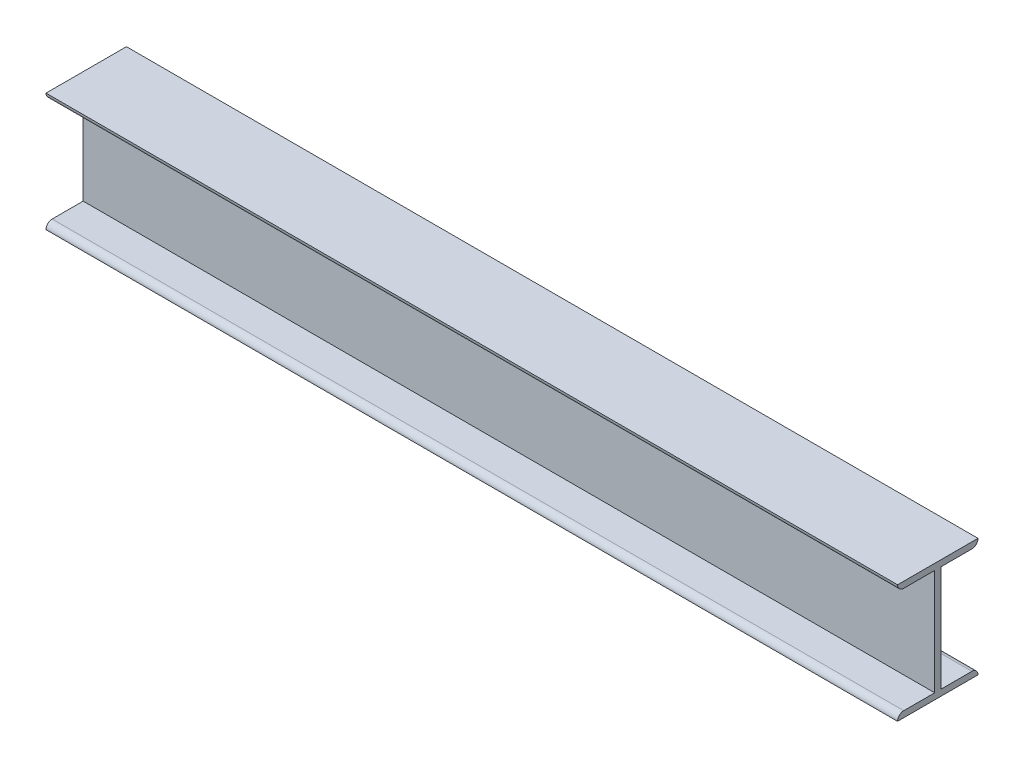
ISO-10303-21;
HEADER;
FILE_DESCRIPTION(('STEP AP214'),'2;1');
FILE_NAME('part.step','',(''),(''),'','','');
FILE_SCHEMA(('AUTOMOTIVE_DESIGN { 1 0 10303 214 1 1 1 1 }'));
ENDSEC;
DATA;
#1=APPLICATION_CONTEXT('core data for automotive mechanical design processes');
#2=APPLICATION_PROTOCOL_DEFINITION('international standard','automotive_design',2000,#1);
#3=PRODUCT_CONTEXT('',#1,'mechanical');
#4=PRODUCT('Part','Part','',(#3));
#5=PRODUCT_RELATED_PRODUCT_CATEGORY('part','',(#4));
#6=PRODUCT_DEFINITION_FORMATION('','',#4);
#7=PRODUCT_DEFINITION_CONTEXT('part definition',#1,'design');
#8=PRODUCT_DEFINITION('design','',#6,#7);
#9=PRODUCT_DEFINITION_SHAPE('','',#8);
#10=(LENGTH_UNIT() NAMED_UNIT(*) SI_UNIT(.MILLI.,.METRE.));
#11=(NAMED_UNIT(*) PLANE_ANGLE_UNIT() SI_UNIT($,.RADIAN.));
#12=(NAMED_UNIT(*) SI_UNIT($,.STERADIAN.) SOLID_ANGLE_UNIT());
#13=UNCERTAINTY_MEASURE_WITH_UNIT(LENGTH_MEASURE(1.E-05),#10,'distance_accuracy_value','');
#14=(GEOMETRIC_REPRESENTATION_CONTEXT(3) GLOBAL_UNCERTAINTY_ASSIGNED_CONTEXT((#13)) GLOBAL_UNIT_ASSIGNED_CONTEXT((#10,
#11,#12)) REPRESENTATION_CONTEXT('',''));
#15=CARTESIAN_POINT('',(0.,0.,0.));
#16=DIRECTION('',(0.,0.,1.));
#17=DIRECTION('',(1.,0.,0.));
#18=AXIS2_PLACEMENT_3D('',#15,#16,#17);
#19=CARTESIAN_POINT('',(0.,250.,170.));
#20=DIRECTION('',(1.,0.,0.));
#21=DIRECTION('',(0.,1.,0.));
#22=AXIS2_PLACEMENT_3D('',#19,#20,#21);
#23=PLANE('',#22);
#24=DIRECTION('',(0.,0.,-1.));
#25=VECTOR('',#24,1.);
#26=CARTESIAN_POINT('',(0.,250.,170.));
#27=LINE('',#26,#25);
#28=CARTESIAN_POINT('',(0.,250.,170.));
#29=VERTEX_POINT('',#28);
#30=CARTESIAN_POINT('',(0.,250.,0.));
#31=VERTEX_POINT('',#30);
#32=EDGE_CURVE('E183',#29,#31,#27,.T.);
#33=ORIENTED_EDGE('',*,*,#32,.T.);
#34=CARTESIAN_POINT('',(0.,250.,13.));
#35=DIRECTION('',(1.,0.,0.));
#36=DIRECTION('',(0.,1.,0.));
#37=AXIS2_PLACEMENT_3D('',#34,#35,#36);
#38=CIRCLE('',#37,13.);
#39=CARTESIAN_POINT('',(0.,237.,13.));
#40=VERTEX_POINT('',#39);
#41=EDGE_CURVE('E54',#31,#40,#38,.F.);
#42=ORIENTED_EDGE('',*,*,#41,.T.);
#43=DIRECTION('',(0.,0.,-1.));
#44=VECTOR('',#43,1.);
#45=CARTESIAN_POINT('',(0.,237.,0.));
#46=LINE('',#45,#44);
#47=CARTESIAN_POINT('',(0.,237.,78.5));
#48=VERTEX_POINT('',#47);
#49=EDGE_CURVE('E132',#48,#40,#46,.T.);
#50=ORIENTED_EDGE('',*,*,#49,.F.);
#51=DIRECTION('',(0.,1.,0.));
#52=VECTOR('',#51,1.);
#53=CARTESIAN_POINT('',(0.,237.,78.5));
#54=LINE('',#53,#52);
#55=CARTESIAN_POINT('',(0.,13.,78.5));
#56=VERTEX_POINT('',#55);
#57=EDGE_CURVE('E150',#56,#48,#54,.T.);
#58=ORIENTED_EDGE('',*,*,#57,.F.);
#59=DIRECTION('',(0.,0.,1.));
#60=VECTOR('',#59,1.);
#61=CARTESIAN_POINT('',(0.,13.,0.));
#62=LINE('',#61,#60);
#63=CARTESIAN_POINT('',(0.,13.,13.));
#64=VERTEX_POINT('',#63);
#65=EDGE_CURVE('E138',#64,#56,#62,.T.);
#66=ORIENTED_EDGE('',*,*,#65,.F.);
#67=CARTESIAN_POINT('',(0.,0.,13.));
#68=DIRECTION('',(1.,0.,0.));
#69=DIRECTION('',(0.,1.,0.));
#70=AXIS2_PLACEMENT_3D('',#67,#68,#69);
#71=CIRCLE('',#70,13.);
#72=CARTESIAN_POINT('',(0.,0.,0.));
#73=VERTEX_POINT('',#72);
#74=EDGE_CURVE('E204',#64,#73,#71,.F.);
#75=ORIENTED_EDGE('',*,*,#74,.T.);
#76=DIRECTION('',(0.,0.,-1.));
#77=VECTOR('',#76,1.);
#78=CARTESIAN_POINT('',(0.,0.,170.));
#79=LINE('',#78,#77);
#80=CARTESIAN_POINT('',(0.,0.,170.));
#81=VERTEX_POINT('',#80);
#82=EDGE_CURVE('E193',#81,#73,#79,.T.);
#83=ORIENTED_EDGE('',*,*,#82,.F.);
#84=CARTESIAN_POINT('',(0.,0.,157.));
#85=DIRECTION('',(1.,0.,0.));
#86=DIRECTION('',(0.,1.,0.));
#87=AXIS2_PLACEMENT_3D('',#84,#85,#86);
#88=CIRCLE('',#87,13.);
#89=CARTESIAN_POINT('',(0.,13.,157.));
#90=VERTEX_POINT('',#89);
#91=EDGE_CURVE('E196',#81,#90,#88,.F.);
#92=ORIENTED_EDGE('',*,*,#91,.T.);
#93=DIRECTION('',(0.,0.,1.));
#94=VECTOR('',#93,1.);
#95=CARTESIAN_POINT('',(0.,13.,170.));
#96=LINE('',#95,#94);
#97=CARTESIAN_POINT('',(0.,13.,91.5));
#98=VERTEX_POINT('',#97);
#99=EDGE_CURVE('E158',#98,#90,#96,.T.);
#100=ORIENTED_EDGE('',*,*,#99,.F.);
#101=DIRECTION('',(0.,-1.,0.));
#102=VECTOR('',#101,1.);
#103=CARTESIAN_POINT('',(0.,237.,91.5));
#104=LINE('',#103,#102);
#105=CARTESIAN_POINT('',(0.,237.,91.5));
#106=VERTEX_POINT('',#105);
#107=EDGE_CURVE('E166',#106,#98,#104,.T.);
#108=ORIENTED_EDGE('',*,*,#107,.F.);
#109=DIRECTION('',(0.,0.,-1.));
#110=VECTOR('',#109,1.);
#111=CARTESIAN_POINT('',(0.,237.,170.));
#112=LINE('',#111,#110);
#113=CARTESIAN_POINT('',(0.,237.,157.));
#114=VERTEX_POINT('',#113);
#115=EDGE_CURVE('E153',#114,#106,#112,.T.);
#116=ORIENTED_EDGE('',*,*,#115,.F.);
#117=CARTESIAN_POINT('',(0.,250.,157.));
#118=DIRECTION('',(1.,0.,0.));
#119=DIRECTION('',(0.,1.,0.));
#120=AXIS2_PLACEMENT_3D('',#117,#118,#119);
#121=CIRCLE('',#120,13.);
#122=EDGE_CURVE('E210',#114,#29,#121,.F.);
#123=ORIENTED_EDGE('',*,*,#122,.T.);
#124=EDGE_LOOP('',(#33,#42,#50,#58,#66,#75,#83,#92,#100,#108,#116,#123));
#125=FACE_BOUND('',#124,.T.);
#126=ADVANCED_FACE('F32',(#125),#23,.F.);
#127=CARTESIAN_POINT('',(0.,0.,170.));
#128=DIRECTION('',(0.,1.,0.));
#129=DIRECTION('',(0.,0.,1.));
#130=AXIS2_PLACEMENT_3D('',#127,#128,#129);
#131=PLANE('',#130);
#132=DIRECTION('',(1.,0.,0.));
#133=VECTOR('',#132,1.);
#134=CARTESIAN_POINT('',(0.,0.,0.));
#135=LINE('',#134,#133);
#136=CARTESIAN_POINT('',(1800.,0.,0.));
#137=VERTEX_POINT('',#136);
#138=EDGE_CURVE('E173',#73,#137,#135,.T.);
#139=ORIENTED_EDGE('',*,*,#138,.T.);
#140=DIRECTION('',(0.,0.,-1.));
#141=VECTOR('',#140,1.);
#142=CARTESIAN_POINT('',(1800.,0.,170.));
#143=LINE('',#142,#141);
#144=CARTESIAN_POINT('',(1800.,0.,170.));
#145=VERTEX_POINT('',#144);
#146=EDGE_CURVE('E191',#145,#137,#143,.T.);
#147=ORIENTED_EDGE('',*,*,#146,.F.);
#148=DIRECTION('',(1.,0.,0.));
#149=VECTOR('',#148,1.);
#150=CARTESIAN_POINT('',(0.,0.,170.));
#151=LINE('',#150,#149);
#152=EDGE_CURVE('E176',#81,#145,#151,.T.);
#153=ORIENTED_EDGE('',*,*,#152,.F.);
#154=ORIENTED_EDGE('',*,*,#82,.T.);
#155=EDGE_LOOP('',(#139,#147,#153,#154));
#156=FACE_BOUND('',#155,.T.);
#157=ADVANCED_FACE('F238',(#156),#131,.F.);
#158=CARTESIAN_POINT('',(1800.,250.,170.));
#159=DIRECTION('',(-1.,0.,0.));
#160=DIRECTION('',(0.,0.,1.));
#161=AXIS2_PLACEMENT_3D('',#158,#159,#160);
#162=PLANE('',#161);
#163=DIRECTION('',(0.,0.,-1.));
#164=VECTOR('',#163,1.);
#165=CARTESIAN_POINT('',(1800.,237.,0.));
#166=LINE('',#165,#164);
#167=CARTESIAN_POINT('',(1800.,237.,78.5));
#168=VERTEX_POINT('',#167);
#169=CARTESIAN_POINT('',(1800.,237.,13.));
#170=VERTEX_POINT('',#169);
#171=EDGE_CURVE('E143',#168,#170,#166,.T.);
#172=ORIENTED_EDGE('',*,*,#171,.T.);
#173=CARTESIAN_POINT('',(1800.,250.,13.));
#174=DIRECTION('',(-1.,0.,0.));
#175=DIRECTION('',(0.,0.,1.));
#176=AXIS2_PLACEMENT_3D('',#173,#174,#175);
#177=CIRCLE('',#176,13.);
#178=CARTESIAN_POINT('',(1800.,250.,0.));
#179=VERTEX_POINT('',#178);
#180=EDGE_CURVE('E11',#170,#179,#177,.F.);
#181=ORIENTED_EDGE('',*,*,#180,.T.);
#182=DIRECTION('',(0.,0.,-1.));
#183=VECTOR('',#182,1.);
#184=CARTESIAN_POINT('',(1800.,250.,170.));
#185=LINE('',#184,#183);
#186=CARTESIAN_POINT('',(1800.,250.,170.));
#187=VERTEX_POINT('',#186);
#188=EDGE_CURVE('E188',#187,#179,#185,.T.);
#189=ORIENTED_EDGE('',*,*,#188,.F.);
#190=CARTESIAN_POINT('',(1800.,250.,157.));
#191=DIRECTION('',(-1.,0.,0.));
#192=DIRECTION('',(0.,0.,1.));
#193=AXIS2_PLACEMENT_3D('',#190,#191,#192);
#194=CIRCLE('',#193,13.);
#195=CARTESIAN_POINT('',(1800.,237.,157.));
#196=VERTEX_POINT('',#195);
#197=EDGE_CURVE('E212',#187,#196,#194,.F.);
#198=ORIENTED_EDGE('',*,*,#197,.T.);
#199=DIRECTION('',(0.,0.,-1.));
#200=VECTOR('',#199,1.);
#201=CARTESIAN_POINT('',(1800.,237.,170.));
#202=LINE('',#201,#200);
#203=CARTESIAN_POINT('',(1800.,237.,91.5));
#204=VERTEX_POINT('',#203);
#205=EDGE_CURVE('E155',#196,#204,#202,.T.);
#206=ORIENTED_EDGE('',*,*,#205,.T.);
#207=DIRECTION('',(0.,-1.,0.));
#208=VECTOR('',#207,1.);
#209=CARTESIAN_POINT('',(1800.,237.,91.5));
#210=LINE('',#209,#208);
#211=CARTESIAN_POINT('',(1800.,13.,91.5));
#212=VERTEX_POINT('',#211);
#213=EDGE_CURVE('E157',#204,#212,#210,.T.);
#214=ORIENTED_EDGE('',*,*,#213,.T.);
#215=DIRECTION('',(0.,0.,1.));
#216=VECTOR('',#215,1.);
#217=CARTESIAN_POINT('',(1800.,13.,170.));
#218=LINE('',#217,#216);
#219=CARTESIAN_POINT('',(1800.,13.,157.));
#220=VERTEX_POINT('',#219);
#221=EDGE_CURVE('E161',#212,#220,#218,.T.);
#222=ORIENTED_EDGE('',*,*,#221,.T.);
#223=CARTESIAN_POINT('',(1800.,0.,157.));
#224=DIRECTION('',(-1.,0.,0.));
#225=DIRECTION('',(0.,0.,1.));
#226=AXIS2_PLACEMENT_3D('',#223,#224,#225);
#227=CIRCLE('',#226,13.);
#228=EDGE_CURVE('E200',#220,#145,#227,.F.);
#229=ORIENTED_EDGE('',*,*,#228,.T.);
#230=ORIENTED_EDGE('',*,*,#146,.T.);
#231=CARTESIAN_POINT('',(1800.,0.,13.));
#232=DIRECTION('',(-1.,0.,0.));
#233=DIRECTION('',(0.,0.,1.));
#234=AXIS2_PLACEMENT_3D('',#231,#232,#233);
#235=CIRCLE('',#234,13.);
#236=CARTESIAN_POINT('',(1800.,13.,13.));
#237=VERTEX_POINT('',#236);
#238=EDGE_CURVE('E128',#137,#237,#235,.F.);
#239=ORIENTED_EDGE('',*,*,#238,.T.);
#240=DIRECTION('',(0.,0.,1.));
#241=VECTOR('',#240,1.);
#242=CARTESIAN_POINT('',(1800.,13.,0.));
#243=LINE('',#242,#241);
#244=CARTESIAN_POINT('',(1800.,13.,78.5));
#245=VERTEX_POINT('',#244);
#246=EDGE_CURVE('E121',#237,#245,#243,.T.);
#247=ORIENTED_EDGE('',*,*,#246,.T.);
#248=DIRECTION('',(0.,1.,0.));
#249=VECTOR('',#248,1.);
#250=CARTESIAN_POINT('',(1800.,237.,78.5));
#251=LINE('',#250,#249);
#252=EDGE_CURVE('E125',#245,#168,#251,.T.);
#253=ORIENTED_EDGE('',*,*,#252,.T.);
#254=EDGE_LOOP('',(#172,#181,#189,#198,#206,#214,#222,#229,#230,#239,#247,#253));
#255=FACE_BOUND('',#254,.T.);
#256=ADVANCED_FACE('F123',(#255),#162,.F.);
#257=CARTESIAN_POINT('',(0.,250.,170.));
#258=DIRECTION('',(0.,-1.,0.));
#259=DIRECTION('',(0.,0.,-1.));
#260=AXIS2_PLACEMENT_3D('',#257,#258,#259);
#261=PLANE('',#260);
#262=DIRECTION('',(-1.,0.,0.));
#263=VECTOR('',#262,1.);
#264=CARTESIAN_POINT('',(0.,250.,0.));
#265=LINE('',#264,#263);
#266=EDGE_CURVE('E180',#179,#31,#265,.T.);
#267=ORIENTED_EDGE('',*,*,#266,.T.);
#268=ORIENTED_EDGE('',*,*,#32,.F.);
#269=DIRECTION('',(-1.,0.,0.));
#270=VECTOR('',#269,1.);
#271=CARTESIAN_POINT('',(0.,250.,170.));
#272=LINE('',#271,#270);
#273=EDGE_CURVE('E179',#187,#29,#272,.T.);
#274=ORIENTED_EDGE('',*,*,#273,.F.);
#275=ORIENTED_EDGE('',*,*,#188,.T.);
#276=EDGE_LOOP('',(#267,#268,#274,#275));
#277=FACE_BOUND('',#276,.T.);
#278=ADVANCED_FACE('F228',(#277),#261,.F.);
#279=CARTESIAN_POINT('',(1800.,13.,170.));
#280=DIRECTION('',(0.,-1.,0.));
#281=DIRECTION('',(0.,0.,-1.));
#282=AXIS2_PLACEMENT_3D('',#279,#280,#281);
#283=PLANE('',#282);
#284=ORIENTED_EDGE('',*,*,#99,.T.);
#285=DIRECTION('',(-1.,0.,0.));
#286=VECTOR('',#285,1.);
#287=CARTESIAN_POINT('',(1800.,13.,157.));
#288=LINE('',#287,#286);
#289=EDGE_CURVE('E198',#90,#220,#288,.F.);
#290=ORIENTED_EDGE('',*,*,#289,.T.);
#291=ORIENTED_EDGE('',*,*,#221,.F.);
#292=DIRECTION('',(-1.,0.,0.));
#293=VECTOR('',#292,1.);
#294=CARTESIAN_POINT('',(1800.,13.,91.5));
#295=LINE('',#294,#293);
#296=EDGE_CURVE('E171',#212,#98,#295,.T.);
#297=ORIENTED_EDGE('',*,*,#296,.T.);
#298=EDGE_LOOP('',(#284,#290,#291,#297));
#299=FACE_BOUND('',#298,.T.);
#300=ADVANCED_FACE('F261',(#299),#283,.F.);
#301=CARTESIAN_POINT('',(1800.,237.,91.5));
#302=DIRECTION('',(0.,0.,-1.));
#303=DIRECTION('',(-1.,0.,0.));
#304=AXIS2_PLACEMENT_3D('',#301,#302,#303);
#305=PLANE('',#304);
#306=ORIENTED_EDGE('',*,*,#107,.T.);
#307=ORIENTED_EDGE('',*,*,#296,.F.);
#308=ORIENTED_EDGE('',*,*,#213,.F.);
#309=DIRECTION('',(-1.,0.,0.));
#310=VECTOR('',#309,1.);
#311=CARTESIAN_POINT('',(1800.,237.,91.5));
#312=LINE('',#311,#310);
#313=EDGE_CURVE('E164',#204,#106,#312,.T.);
#314=ORIENTED_EDGE('',*,*,#313,.T.);
#315=EDGE_LOOP('',(#306,#307,#308,#314));
#316=FACE_BOUND('',#315,.T.);
#317=ADVANCED_FACE('F264',(#316),#305,.F.);
#318=CARTESIAN_POINT('',(1800.,237.,170.));
#319=DIRECTION('',(0.,1.,0.));
#320=DIRECTION('',(0.,0.,1.));
#321=AXIS2_PLACEMENT_3D('',#318,#319,#320);
#322=PLANE('',#321);
#323=ORIENTED_EDGE('',*,*,#205,.F.);
#324=DIRECTION('',(-1.,0.,0.));
#325=VECTOR('',#324,1.);
#326=CARTESIAN_POINT('',(0.,237.,157.));
#327=LINE('',#326,#325);
#328=EDGE_CURVE('E207',#196,#114,#327,.T.);
#329=ORIENTED_EDGE('',*,*,#328,.T.);
#330=ORIENTED_EDGE('',*,*,#115,.T.);
#331=ORIENTED_EDGE('',*,*,#313,.F.);
#332=EDGE_LOOP('',(#323,#329,#330,#331));
#333=FACE_BOUND('',#332,.T.);
#334=ADVANCED_FACE('F221',(#333),#322,.F.);
#335=CARTESIAN_POINT('',(1800.,237.,0.));
#336=DIRECTION('',(0.,1.,0.));
#337=DIRECTION('',(0.,0.,1.));
#338=AXIS2_PLACEMENT_3D('',#335,#336,#337);
#339=PLANE('',#338);
#340=ORIENTED_EDGE('',*,*,#49,.T.);
#341=DIRECTION('',(-1.,0.,0.));
#342=VECTOR('',#341,1.);
#343=CARTESIAN_POINT('',(1800.,237.,13.));
#344=LINE('',#343,#342);
#345=EDGE_CURVE('E40',#40,#170,#344,.F.);
#346=ORIENTED_EDGE('',*,*,#345,.T.);
#347=ORIENTED_EDGE('',*,*,#171,.F.);
#348=DIRECTION('',(-1.,0.,0.));
#349=VECTOR('',#348,1.);
#350=CARTESIAN_POINT('',(1800.,237.,78.5));
#351=LINE('',#350,#349);
#352=EDGE_CURVE('E142',#168,#48,#351,.T.);
#353=ORIENTED_EDGE('',*,*,#352,.T.);
#354=EDGE_LOOP('',(#340,#346,#347,#353));
#355=FACE_BOUND('',#354,.T.);
#356=ADVANCED_FACE('F232',(#355),#339,.F.);
#357=CARTESIAN_POINT('',(1800.,237.,78.5));
#358=DIRECTION('',(0.,0.,1.));
#359=DIRECTION('',(1.,0.,0.));
#360=AXIS2_PLACEMENT_3D('',#357,#358,#359);
#361=PLANE('',#360);
#362=ORIENTED_EDGE('',*,*,#57,.T.);
#363=ORIENTED_EDGE('',*,*,#352,.F.);
#364=ORIENTED_EDGE('',*,*,#252,.F.);
#365=DIRECTION('',(-1.,0.,0.));
#366=VECTOR('',#365,1.);
#367=CARTESIAN_POINT('',(1800.,13.,78.5));
#368=LINE('',#367,#366);
#369=EDGE_CURVE('E135',#245,#56,#368,.T.);
#370=ORIENTED_EDGE('',*,*,#369,.T.);
#371=EDGE_LOOP('',(#362,#363,#364,#370));
#372=FACE_BOUND('',#371,.T.);
#373=ADVANCED_FACE('F145',(#372),#361,.F.);
#374=CARTESIAN_POINT('',(1800.,13.,0.));
#375=DIRECTION('',(0.,-1.,0.));
#376=DIRECTION('',(0.,0.,-1.));
#377=AXIS2_PLACEMENT_3D('',#374,#375,#376);
#378=PLANE('',#377);
#379=ORIENTED_EDGE('',*,*,#246,.F.);
#380=DIRECTION('',(-1.,0.,0.));
#381=VECTOR('',#380,1.);
#382=CARTESIAN_POINT('',(1800.,13.,13.));
#383=LINE('',#382,#381);
#384=EDGE_CURVE('E202',#237,#64,#383,.T.);
#385=ORIENTED_EDGE('',*,*,#384,.T.);
#386=ORIENTED_EDGE('',*,*,#65,.T.);
#387=ORIENTED_EDGE('',*,*,#369,.F.);
#388=EDGE_LOOP('',(#379,#385,#386,#387));
#389=FACE_BOUND('',#388,.T.);
#390=ADVANCED_FACE('F136',(#389),#378,.F.);
#391=CARTESIAN_POINT('',(0.,0.,157.));
#392=DIRECTION('',(1.,0.,0.));
#393=DIRECTION('',(0.,0.,-1.));
#394=AXIS2_PLACEMENT_3D('',#391,#392,#393);
#395=CYLINDRICAL_SURFACE('',#394,13.);
#396=ORIENTED_EDGE('',*,*,#228,.F.);
#397=ORIENTED_EDGE('',*,*,#289,.F.);
#398=ORIENTED_EDGE('',*,*,#91,.F.);
#399=ORIENTED_EDGE('',*,*,#152,.T.);
#400=EDGE_LOOP('',(#396,#397,#398,#399));
#401=FACE_BOUND('',#400,.T.);
#402=ADVANCED_FACE('F242',(#401),#395,.T.);
#403=CARTESIAN_POINT('',(1800.,0.,13.));
#404=DIRECTION('',(-1.,0.,0.));
#405=DIRECTION('',(0.,0.,1.));
#406=AXIS2_PLACEMENT_3D('',#403,#404,#405);
#407=CYLINDRICAL_SURFACE('',#406,13.);
#408=ORIENTED_EDGE('',*,*,#238,.F.);
#409=ORIENTED_EDGE('',*,*,#138,.F.);
#410=ORIENTED_EDGE('',*,*,#74,.F.);
#411=ORIENTED_EDGE('',*,*,#384,.F.);
#412=EDGE_LOOP('',(#408,#409,#410,#411));
#413=FACE_BOUND('',#412,.T.);
#414=ADVANCED_FACE('F240',(#413),#407,.T.);
#415=CARTESIAN_POINT('',(1800.,250.,157.));
#416=DIRECTION('',(1.,0.,0.));
#417=DIRECTION('',(0.,0.,-1.));
#418=AXIS2_PLACEMENT_3D('',#415,#416,#417);
#419=CYLINDRICAL_SURFACE('',#418,13.);
#420=ORIENTED_EDGE('',*,*,#197,.F.);
#421=ORIENTED_EDGE('',*,*,#273,.T.);
#422=ORIENTED_EDGE('',*,*,#122,.F.);
#423=ORIENTED_EDGE('',*,*,#328,.F.);
#424=EDGE_LOOP('',(#420,#421,#422,#423));
#425=FACE_BOUND('',#424,.T.);
#426=ADVANCED_FACE('F224',(#425),#419,.T.);
#427=CARTESIAN_POINT('',(0.,250.,13.));
#428=DIRECTION('',(-1.,0.,0.));
#429=DIRECTION('',(0.,0.,1.));
#430=AXIS2_PLACEMENT_3D('',#427,#428,#429);
#431=CYLINDRICAL_SURFACE('',#430,13.);
#432=ORIENTED_EDGE('',*,*,#180,.F.);
#433=ORIENTED_EDGE('',*,*,#345,.F.);
#434=ORIENTED_EDGE('',*,*,#41,.F.);
#435=ORIENTED_EDGE('',*,*,#266,.F.);
#436=EDGE_LOOP('',(#432,#433,#434,#435));
#437=FACE_BOUND('',#436,.T.);
#438=ADVANCED_FACE('F34',(#437),#431,.T.);
#439=CLOSED_SHELL('',(#126,#157,#256,#278,#300,#317,#334,#356,#373,#390,#402,#414,#426,#438));
#440=MANIFOLD_SOLID_BREP('B2',#439);
#441=ADVANCED_BREP_SHAPE_REPRESENTATION('',(#18,#440),#14);
#442=SHAPE_DEFINITION_REPRESENTATION(#9,#441);
ENDSEC;
END-ISO-10303-21;
